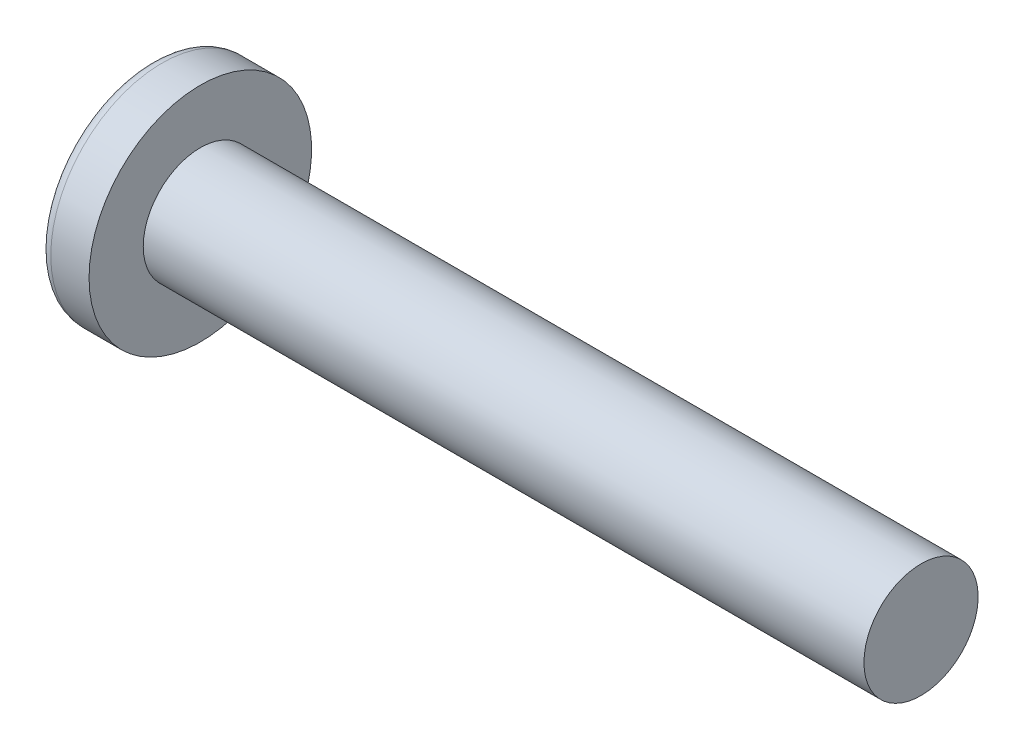
ISO-10303-21;
HEADER;
FILE_DESCRIPTION(('STEP AP214'),'2;1');
FILE_NAME('part.step','',(''),(''),'','','');
FILE_SCHEMA(('AUTOMOTIVE_DESIGN { 1 0 10303 214 1 1 1 1 }'));
ENDSEC;
DATA;
#1=APPLICATION_CONTEXT('core data for automotive mechanical design processes');
#2=APPLICATION_PROTOCOL_DEFINITION('international standard','automotive_design',2000,#1);
#3=PRODUCT_CONTEXT('',#1,'mechanical');
#4=PRODUCT('Part','Part','',(#3));
#5=PRODUCT_RELATED_PRODUCT_CATEGORY('part','',(#4));
#6=PRODUCT_DEFINITION_FORMATION('','',#4);
#7=PRODUCT_DEFINITION_CONTEXT('part definition',#1,'design');
#8=PRODUCT_DEFINITION('design','',#6,#7);
#9=PRODUCT_DEFINITION_SHAPE('','',#8);
#10=(LENGTH_UNIT() NAMED_UNIT(*) SI_UNIT(.MILLI.,.METRE.));
#11=(NAMED_UNIT(*) PLANE_ANGLE_UNIT() SI_UNIT($,.RADIAN.));
#12=(NAMED_UNIT(*) SI_UNIT($,.STERADIAN.) SOLID_ANGLE_UNIT());
#13=UNCERTAINTY_MEASURE_WITH_UNIT(LENGTH_MEASURE(1.E-05),#10,'distance_accuracy_value','');
#14=(GEOMETRIC_REPRESENTATION_CONTEXT(3) GLOBAL_UNCERTAINTY_ASSIGNED_CONTEXT((#13)) GLOBAL_UNIT_ASSIGNED_CONTEXT((#10,
#11,#12)) REPRESENTATION_CONTEXT('',''));
#15=CARTESIAN_POINT('',(0.,0.,0.));
#16=DIRECTION('',(0.,0.,1.));
#17=DIRECTION('',(1.,0.,0.));
#18=AXIS2_PLACEMENT_3D('',#15,#16,#17);
#19=CARTESIAN_POINT('',(4.02336,0.,0.));
#20=DIRECTION('',(-1.,0.,0.));
#21=DIRECTION('',(0.,1.,0.));
#22=AXIS2_PLACEMENT_3D('',#19,#20,#21);
#23=SPHERICAL_SURFACE('',#22,4.02336);
#24=CARTESIAN_POINT('',(0.754157473864418,0.,0.));
#25=DIRECTION('',(-1.,0.,0.));
#26=DIRECTION('',(0.,0.,1.));
#27=AXIS2_PLACEMENT_3D('',#24,#25,#26);
#28=CIRCLE('',#27,2.3451525606469);
#29=CARTESIAN_POINT('',(0.754157473864418,0.,2.3451525606469));
#30=VERTEX_POINT('',#29);
#31=EDGE_CURVE('E155',#30,#30,#28,.T.);
#32=ORIENTED_EDGE('',*,*,#31,.T.);
#33=EDGE_LOOP('',(#32));
#34=FACE_BOUND('',#33,.T.);
#35=CARTESIAN_POINT('',(4.01770186530247,-0.0538498336730852,0.));
#36=DIRECTION('',(-0.104497210902911,-0.994525179627702,0.));
#37=DIRECTION('',(0.994525179627702,-0.104497210902911,0.));
#38=AXIS2_PLACEMENT_3D('',#35,#36,#37);
#39=CIRCLE('',#38,4.02299563391823);
#40=CARTESIAN_POINT('',(0.259410845244607,0.341043063361975,1.37978334493095));
#41=VERTEX_POINT('',#40);
#42=CARTESIAN_POINT('',(0.0332155077767118,0.364809964762591,0.364809964762592));
#43=VERTEX_POINT('',#42);
#44=EDGE_CURVE('E186',#41,#43,#39,.T.);
#45=ORIENTED_EDGE('',*,*,#44,.F.);
#46=CARTESIAN_POINT('',(3.2260782242415,0.,-0.995700317236856));
#47=DIRECTION('',(0.625039893301157,0.,0.780592807923618));
#48=DIRECTION('',(0.780592807923618,0.,-0.625039893301158));
#49=AXIS2_PLACEMENT_3D('',#46,#47,#48);
#50=CIRCLE('',#49,3.81580245006182);
#51=CARTESIAN_POINT('',(0.259410845244606,-0.341043063361985,1.37978334493095));
#52=VERTEX_POINT('',#51);
#53=EDGE_CURVE('E151',#41,#52,#50,.T.);
#54=ORIENTED_EDGE('',*,*,#53,.T.);
#55=CARTESIAN_POINT('',(4.01770186530246,0.0538498336730848,0.));
#56=DIRECTION('',(-0.104497210902911,0.994525179627702,0.));
#57=DIRECTION('',(-0.994525179627702,-0.104497210902911,0.));
#58=AXIS2_PLACEMENT_3D('',#55,#56,#57);
#59=CIRCLE('',#58,4.02299563391823);
#60=CARTESIAN_POINT('',(0.0332155077767127,-0.364809964762593,0.364809964762591));
#61=VERTEX_POINT('',#60);
#62=EDGE_CURVE('E107',#61,#52,#59,.T.);
#63=ORIENTED_EDGE('',*,*,#62,.F.);
#64=CARTESIAN_POINT('',(4.01770186530247,0.,-0.0538498336730848));
#65=DIRECTION('',(-0.104497210902911,0.,-0.994525179627702));
#66=DIRECTION('',(-0.994525179627702,0.,0.104497210902911));
#67=AXIS2_PLACEMENT_3D('',#64,#65,#66);
#68=CIRCLE('',#67,4.02299563391823);
#69=CARTESIAN_POINT('',(0.259410845244606,-1.37978334493095,0.341043063361979));
#70=VERTEX_POINT('',#69);
#71=EDGE_CURVE('E132',#70,#61,#68,.T.);
#72=ORIENTED_EDGE('',*,*,#71,.F.);
#73=CARTESIAN_POINT('',(3.2260782242415,0.995700317236855,0.));
#74=DIRECTION('',(0.625039893301157,-0.780592807923618,0.));
#75=DIRECTION('',(0.780592807923618,0.625039893301158,0.));
#76=AXIS2_PLACEMENT_3D('',#73,#74,#75);
#77=CIRCLE('',#76,3.81580245006182);
#78=CARTESIAN_POINT('',(0.259410845244606,-1.37978334493095,-0.34104306336198));
#79=VERTEX_POINT('',#78);
#80=EDGE_CURVE('E140',#70,#79,#77,.T.);
#81=ORIENTED_EDGE('',*,*,#80,.T.);
#82=CARTESIAN_POINT('',(4.01770186530247,0.,0.0538498336730852));
#83=DIRECTION('',(-0.104497210902911,0.,0.994525179627702));
#84=DIRECTION('',(0.994525179627702,0.,0.104497210902911));
#85=AXIS2_PLACEMENT_3D('',#82,#83,#84);
#86=CIRCLE('',#85,4.02299563391823);
#87=CARTESIAN_POINT('',(0.0332155077767127,-0.36480996476259,-0.364809964762592));
#88=VERTEX_POINT('',#87);
#89=EDGE_CURVE('E50',#88,#79,#86,.T.);
#90=ORIENTED_EDGE('',*,*,#89,.F.);
#91=CARTESIAN_POINT('',(0.259410845244607,-0.341043063361974,-1.37978334493095));
#92=VERTEX_POINT('',#91);
#93=EDGE_CURVE('E193',#92,#88,#59,.T.);
#94=ORIENTED_EDGE('',*,*,#93,.F.);
#95=CARTESIAN_POINT('',(3.2260782242415,0.,0.995700317236856));
#96=DIRECTION('',(0.625039893301157,0.,-0.780592807923618));
#97=DIRECTION('',(-0.780592807923618,0.,-0.625039893301158));
#98=AXIS2_PLACEMENT_3D('',#95,#96,#97);
#99=CIRCLE('',#98,3.81580245006182);
#100=CARTESIAN_POINT('',(0.259410845244607,0.341043063361985,-1.37978334493095));
#101=VERTEX_POINT('',#100);
#102=EDGE_CURVE('E133',#92,#101,#99,.T.);
#103=ORIENTED_EDGE('',*,*,#102,.T.);
#104=CARTESIAN_POINT('',(0.0332155077767118,0.364809964762593,-0.364809964762592));
#105=VERTEX_POINT('',#104);
#106=EDGE_CURVE('E181',#105,#101,#39,.T.);
#107=ORIENTED_EDGE('',*,*,#106,.F.);
#108=CARTESIAN_POINT('',(0.259410845244607,1.37978334493095,-0.34104306336198));
#109=VERTEX_POINT('',#108);
#110=EDGE_CURVE('E43',#109,#105,#86,.T.);
#111=ORIENTED_EDGE('',*,*,#110,.F.);
#112=CARTESIAN_POINT('',(3.2260782242415,-0.995700317236856,0.));
#113=DIRECTION('',(0.625039893301157,0.780592807923618,0.));
#114=DIRECTION('',(-0.780592807923618,0.625039893301158,0.));
#115=AXIS2_PLACEMENT_3D('',#112,#113,#114);
#116=CIRCLE('',#115,3.81580245006182);
#117=CARTESIAN_POINT('',(0.259410845244607,1.37978334493095,0.34104306336198));
#118=VERTEX_POINT('',#117);
#119=EDGE_CURVE('E11',#109,#118,#116,.T.);
#120=ORIENTED_EDGE('',*,*,#119,.T.);
#121=EDGE_CURVE('E169',#43,#118,#68,.T.);
#122=ORIENTED_EDGE('',*,*,#121,.F.);
#123=EDGE_LOOP('',(#45,#54,#63,#72,#81,#90,#94,#103,#107,#111,#120,#122));
#124=FACE_BOUND('',#123,.T.);
#125=ADVANCED_FACE('F35',(#34,#124),#23,.T.);
#126=CARTESIAN_POINT('',(1.98257918552036,0.,-0.159985520361991));
#127=DIRECTION('',(-0.104497210902911,0.,0.994525179627702));
#128=DIRECTION('',(0.994525179627702,0.,0.104497210902911));
#129=AXIS2_PLACEMENT_3D('',#126,#127,#128);
#130=PLANE('',#129);
#131=ORIENTED_EDGE('',*,*,#110,.T.);
#132=DIRECTION('',(0.989139306726397,-0.103931303967629,0.103931303967629));
#133=VECTOR('',#132,1.);
#134=CARTESIAN_POINT('',(1.99902610304942,0.158257402215822,-0.158257402215822));
#135=LINE('',#134,#133);
#136=CARTESIAN_POINT('',(1.7526,0.184150000000001,-0.184149999999999));
#137=VERTEX_POINT('',#136);
#138=EDGE_CURVE('E175',#105,#137,#135,.T.);
#139=ORIENTED_EDGE('',*,*,#138,.T.);
#140=DIRECTION('',(0.777980423727664,-0.622948092912368,0.0817443198844284));
#141=VECTOR('',#140,1.);
#142=CARTESIAN_POINT('',(0.,1.5875,-0.3683));
#143=LINE('',#142,#141);
#144=EDGE_CURVE('E156',#109,#137,#143,.T.);
#145=ORIENTED_EDGE('',*,*,#144,.F.);
#146=EDGE_LOOP('',(#131,#139,#145));
#147=FACE_BOUND('',#146,.T.);
#148=ADVANCED_FACE('F174',(#147),#130,.T.);
#149=DIRECTION('',(0.777980423727664,0.622948092912368,0.0817443198844285));
#150=VECTOR('',#149,1.);
#151=CARTESIAN_POINT('',(0.,-1.5875,-0.3683));
#152=LINE('',#151,#150);
#153=CARTESIAN_POINT('',(1.7526,-0.18415,-0.18415));
#154=VERTEX_POINT('',#153);
#155=EDGE_CURVE('E141',#79,#154,#152,.T.);
#156=ORIENTED_EDGE('',*,*,#155,.T.);
#157=DIRECTION('',(-0.989139306726397,-0.103931303967628,-0.103931303967629));
#158=VECTOR('',#157,1.);
#159=CARTESIAN_POINT('',(1.99902610304942,-0.158257402215821,-0.158257402215822));
#160=LINE('',#159,#158);
#161=EDGE_CURVE('E196',#154,#88,#160,.T.);
#162=ORIENTED_EDGE('',*,*,#161,.T.);
#163=ORIENTED_EDGE('',*,*,#89,.T.);
#164=EDGE_LOOP('',(#156,#162,#163));
#165=FACE_BOUND('',#164,.T.);
#166=ADVANCED_FACE('F211',(#165),#130,.T.);
#167=CARTESIAN_POINT('',(1.98257918552036,0.,0.159985520361991));
#168=DIRECTION('',(-0.104497210902911,0.,-0.994525179627702));
#169=DIRECTION('',(-0.994525179627702,0.,0.104497210902911));
#170=AXIS2_PLACEMENT_3D('',#167,#168,#169);
#171=PLANE('',#170);
#172=DIRECTION('',(0.777980423727664,-0.622948092912368,-0.0817443198844284));
#173=VECTOR('',#172,1.);
#174=CARTESIAN_POINT('',(0.,1.5875,0.3683));
#175=LINE('',#174,#173);
#176=CARTESIAN_POINT('',(1.7526,0.18415,0.18415));
#177=VERTEX_POINT('',#176);
#178=EDGE_CURVE('E212',#118,#177,#175,.T.);
#179=ORIENTED_EDGE('',*,*,#178,.T.);
#180=DIRECTION('',(-0.989139306726397,0.103931303967628,0.103931303967628));
#181=VECTOR('',#180,1.);
#182=CARTESIAN_POINT('',(1.99902610304942,0.158257402215821,0.158257402215822));
#183=LINE('',#182,#181);
#184=EDGE_CURVE('E190',#177,#43,#183,.T.);
#185=ORIENTED_EDGE('',*,*,#184,.T.);
#186=ORIENTED_EDGE('',*,*,#121,.T.);
#187=EDGE_LOOP('',(#179,#185,#186));
#188=FACE_BOUND('',#187,.T.);
#189=ADVANCED_FACE('F216',(#188),#171,.T.);
#190=ORIENTED_EDGE('',*,*,#71,.T.);
#191=DIRECTION('',(0.989139306726397,0.103931303967629,-0.103931303967628));
#192=VECTOR('',#191,1.);
#193=CARTESIAN_POINT('',(1.99902610304942,-0.158257402215822,0.158257402215822));
#194=LINE('',#193,#192);
#195=CARTESIAN_POINT('',(1.7526,-0.184150000000001,0.18415));
#196=VERTEX_POINT('',#195);
#197=EDGE_CURVE('E105',#61,#196,#194,.T.);
#198=ORIENTED_EDGE('',*,*,#197,.T.);
#199=DIRECTION('',(0.777980423727664,0.622948092912368,-0.0817443198844282));
#200=VECTOR('',#199,1.);
#201=CARTESIAN_POINT('',(0.,-1.5875,0.368299999999999));
#202=LINE('',#201,#200);
#203=EDGE_CURVE('E130',#70,#196,#202,.T.);
#204=ORIENTED_EDGE('',*,*,#203,.F.);
#205=EDGE_LOOP('',(#190,#198,#204));
#206=FACE_BOUND('',#205,.T.);
#207=ADVANCED_FACE('F129',(#206),#171,.T.);
#208=CARTESIAN_POINT('',(-25.4,0.,0.));
#209=DIRECTION('',(-1.,0.,0.));
#210=DIRECTION('',(0.,0.,1.));
#211=AXIS2_PLACEMENT_3D('',#208,#209,#210);
#212=CYLINDRICAL_SURFACE('',#211,1.2573);
#213=CARTESIAN_POINT('',(17.6784,0.,0.));
#214=DIRECTION('',(-1.,0.,0.));
#215=DIRECTION('',(0.,0.,1.));
#216=AXIS2_PLACEMENT_3D('',#213,#214,#215);
#217=CIRCLE('',#216,1.2573);
#218=CARTESIAN_POINT('',(17.6784,0.,1.2573));
#219=VERTEX_POINT('',#218);
#220=EDGE_CURVE('E152',#219,#219,#217,.T.);
#221=ORIENTED_EDGE('',*,*,#220,.T.);
#222=EDGE_LOOP('',(#221));
#223=FACE_BOUND('',#222,.T.);
#224=CARTESIAN_POINT('',(1.8034,0.,0.));
#225=DIRECTION('',(-1.,0.,0.));
#226=DIRECTION('',(0.,0.,1.));
#227=AXIS2_PLACEMENT_3D('',#224,#225,#226);
#228=CIRCLE('',#227,1.2573);
#229=CARTESIAN_POINT('',(1.8034,0.,1.2573));
#230=VERTEX_POINT('',#229);
#231=EDGE_CURVE('E165',#230,#230,#228,.T.);
#232=ORIENTED_EDGE('',*,*,#231,.F.);
#233=EDGE_LOOP('',(#232));
#234=FACE_BOUND('',#233,.T.);
#235=ADVANCED_FACE('F37',(#223,#234),#212,.T.);
#236=CARTESIAN_POINT('',(1.8034,1.2573,0.));
#237=DIRECTION('',(-1.,0.,0.));
#238=DIRECTION('',(0.,0.,1.));
#239=AXIS2_PLACEMENT_3D('',#236,#237,#238);
#240=PLANE('',#239);
#241=CARTESIAN_POINT('',(1.8034,0.,0.));
#242=DIRECTION('',(-1.,0.,0.));
#243=DIRECTION('',(0.,0.,1.));
#244=AXIS2_PLACEMENT_3D('',#241,#242,#243);
#245=CIRCLE('',#244,2.4511);
#246=CARTESIAN_POINT('',(1.8034,0.,2.4511));
#247=VERTEX_POINT('',#246);
#248=EDGE_CURVE('E162',#247,#247,#245,.T.);
#249=ORIENTED_EDGE('',*,*,#248,.F.);
#250=EDGE_LOOP('',(#249));
#251=FACE_BOUND('',#250,.T.);
#252=ORIENTED_EDGE('',*,*,#231,.T.);
#253=EDGE_LOOP('',(#252));
#254=FACE_BOUND('',#253,.T.);
#255=ADVANCED_FACE('F244',(#251,#254),#240,.F.);
#256=CARTESIAN_POINT('',(-25.4,0.,0.));
#257=DIRECTION('',(-1.,0.,0.));
#258=DIRECTION('',(0.,0.,1.));
#259=AXIS2_PLACEMENT_3D('',#256,#257,#258);
#260=CYLINDRICAL_SURFACE('',#259,2.4511);
#261=ORIENTED_EDGE('',*,*,#248,.T.);
#262=EDGE_LOOP('',(#261));
#263=FACE_BOUND('',#262,.T.);
#264=CARTESIAN_POINT('',(0.960546522231563,0.,0.));
#265=DIRECTION('',(-1.,0.,0.));
#266=DIRECTION('',(0.,0.,1.));
#267=AXIS2_PLACEMENT_3D('',#264,#265,#266);
#268=CIRCLE('',#267,2.4511);
#269=CARTESIAN_POINT('',(0.960546522231563,0.,2.4511));
#270=VERTEX_POINT('',#269);
#271=EDGE_CURVE('E159',#270,#270,#268,.T.);
#272=ORIENTED_EDGE('',*,*,#271,.F.);
#273=EDGE_LOOP('',(#272));
#274=FACE_BOUND('',#273,.T.);
#275=ADVANCED_FACE('F241',(#263,#274),#260,.T.);
#276=CARTESIAN_POINT('',(0.960546522231562,0.,0.));
#277=DIRECTION('',(-1.,0.,0.));
#278=DIRECTION('',(0.,0.,1.));
#279=AXIS2_PLACEMENT_3D('',#276,#277,#278);
#280=TOROIDAL_SURFACE('',#279,2.1971,0.254);
#281=ORIENTED_EDGE('',*,*,#271,.T.);
#282=EDGE_LOOP('',(#281));
#283=FACE_BOUND('',#282,.T.);
#284=ORIENTED_EDGE('',*,*,#31,.F.);
#285=EDGE_LOOP('',(#284));
#286=FACE_BOUND('',#285,.T.);
#287=ADVANCED_FACE('F238',(#283,#286),#280,.T.);
#288=CARTESIAN_POINT('',(17.6784,1.2573,0.));
#289=DIRECTION('',(1.,0.,0.));
#290=DIRECTION('',(0.,0.,-1.));
#291=AXIS2_PLACEMENT_3D('',#288,#289,#290);
#292=PLANE('',#291);
#293=ORIENTED_EDGE('',*,*,#220,.F.);
#294=EDGE_LOOP('',(#293));
#295=FACE_BOUND('',#294,.T.);
#296=ADVANCED_FACE('F236',(#295),#292,.T.);
#297=CARTESIAN_POINT('',(1.7526,0.18415,0.18415));
#298=DIRECTION('',(0.625039893301157,0.780592807923618,0.));
#299=DIRECTION('',(-0.780592807923618,0.625039893301158,0.));
#300=AXIS2_PLACEMENT_3D('',#297,#298,#299);
#301=PLANE('',#300);
#302=ORIENTED_EDGE('',*,*,#144,.T.);
#303=DIRECTION('',(0.,0.,-1.));
#304=VECTOR('',#303,1.);
#305=CARTESIAN_POINT('',(1.7526,0.18415,0.18415));
#306=LINE('',#305,#304);
#307=EDGE_CURVE('E123',#177,#137,#306,.T.);
#308=ORIENTED_EDGE('',*,*,#307,.F.);
#309=ORIENTED_EDGE('',*,*,#178,.F.);
#310=ORIENTED_EDGE('',*,*,#119,.F.);
#311=EDGE_LOOP('',(#302,#308,#309,#310));
#312=FACE_BOUND('',#311,.T.);
#313=ADVANCED_FACE('F215',(#312),#301,.F.);
#314=CARTESIAN_POINT('',(1.7526,-0.18415,-0.18415));
#315=DIRECTION('',(0.625039893301157,-0.780592807923618,0.));
#316=DIRECTION('',(0.780592807923618,0.625039893301158,0.));
#317=AXIS2_PLACEMENT_3D('',#314,#315,#316);
#318=PLANE('',#317);
#319=ORIENTED_EDGE('',*,*,#203,.T.);
#320=DIRECTION('',(0.,0.,1.));
#321=VECTOR('',#320,1.);
#322=CARTESIAN_POINT('',(1.7526,-0.18415,-0.18415));
#323=LINE('',#322,#321);
#324=EDGE_CURVE('E122',#154,#196,#323,.T.);
#325=ORIENTED_EDGE('',*,*,#324,.F.);
#326=ORIENTED_EDGE('',*,*,#155,.F.);
#327=ORIENTED_EDGE('',*,*,#80,.F.);
#328=EDGE_LOOP('',(#319,#325,#326,#327));
#329=FACE_BOUND('',#328,.T.);
#330=ADVANCED_FACE('F137',(#329),#318,.F.);
#331=CARTESIAN_POINT('',(1.7526,0.18415,-0.18415));
#332=DIRECTION('',(-1.,0.,0.));
#333=DIRECTION('',(0.,0.,1.));
#334=AXIS2_PLACEMENT_3D('',#331,#332,#333);
#335=PLANE('',#334);
#336=DIRECTION('',(0.,1.,0.));
#337=VECTOR('',#336,1.);
#338=CARTESIAN_POINT('',(1.7526,-0.18415,-0.18415));
#339=LINE('',#338,#337);
#340=EDGE_CURVE('E145',#154,#137,#339,.T.);
#341=ORIENTED_EDGE('',*,*,#340,.F.);
#342=ORIENTED_EDGE('',*,*,#324,.T.);
#343=DIRECTION('',(0.,-1.,0.));
#344=VECTOR('',#343,1.);
#345=CARTESIAN_POINT('',(1.7526,0.18415,0.18415));
#346=LINE('',#345,#344);
#347=EDGE_CURVE('E114',#177,#196,#346,.T.);
#348=ORIENTED_EDGE('',*,*,#347,.F.);
#349=ORIENTED_EDGE('',*,*,#307,.T.);
#350=EDGE_LOOP('',(#341,#342,#348,#349));
#351=FACE_BOUND('',#350,.T.);
#352=ADVANCED_FACE('F143',(#351),#335,.T.);
#353=CARTESIAN_POINT('',(1.7526,0.184150000000001,-0.184149999999999));
#354=DIRECTION('',(0.625039893301157,0.,-0.780592807923618));
#355=DIRECTION('',(0.780592807923618,0.,0.625039893301158));
#356=AXIS2_PLACEMENT_3D('',#353,#354,#355);
#357=PLANE('',#356);
#358=DIRECTION('',(0.777980423727664,0.0817443198844261,0.622948092912369));
#359=VECTOR('',#358,1.);
#360=CARTESIAN_POINT('',(0.,-0.368299999999994,-1.5875));
#361=LINE('',#360,#359);
#362=EDGE_CURVE('E201',#92,#154,#361,.T.);
#363=ORIENTED_EDGE('',*,*,#362,.T.);
#364=ORIENTED_EDGE('',*,*,#340,.T.);
#365=DIRECTION('',(0.777980423727664,-0.0817443198844306,0.622948092912368));
#366=VECTOR('',#365,1.);
#367=CARTESIAN_POINT('',(0.,0.368300000000006,-1.5875));
#368=LINE('',#367,#366);
#369=EDGE_CURVE('E111',#101,#137,#368,.T.);
#370=ORIENTED_EDGE('',*,*,#369,.F.);
#371=ORIENTED_EDGE('',*,*,#102,.F.);
#372=EDGE_LOOP('',(#363,#364,#370,#371));
#373=FACE_BOUND('',#372,.T.);
#374=ADVANCED_FACE('F206',(#373),#357,.F.);
#375=CARTESIAN_POINT('',(1.98257918552036,-0.159985520361991,0.));
#376=DIRECTION('',(-0.104497210902911,0.994525179627702,0.));
#377=DIRECTION('',(-0.994525179627702,-0.104497210902911,0.));
#378=AXIS2_PLACEMENT_3D('',#375,#376,#377);
#379=PLANE('',#378);
#380=ORIENTED_EDGE('',*,*,#93,.T.);
#381=ORIENTED_EDGE('',*,*,#161,.F.);
#382=ORIENTED_EDGE('',*,*,#362,.F.);
#383=EDGE_LOOP('',(#380,#381,#382));
#384=FACE_BOUND('',#383,.T.);
#385=ADVANCED_FACE('F210',(#384),#379,.T.);
#386=CARTESIAN_POINT('',(1.98257918552036,0.159985520361991,0.));
#387=DIRECTION('',(-0.104497210902911,-0.994525179627702,0.));
#388=DIRECTION('',(0.994525179627702,-0.104497210902911,0.));
#389=AXIS2_PLACEMENT_3D('',#386,#387,#388);
#390=PLANE('',#389);
#391=ORIENTED_EDGE('',*,*,#106,.T.);
#392=ORIENTED_EDGE('',*,*,#369,.T.);
#393=ORIENTED_EDGE('',*,*,#138,.F.);
#394=EDGE_LOOP('',(#391,#392,#393));
#395=FACE_BOUND('',#394,.T.);
#396=ADVANCED_FACE('F204',(#395),#390,.T.);
#397=CARTESIAN_POINT('',(1.7526,-0.184150000000001,0.184149999999999));
#398=DIRECTION('',(0.625039893301157,0.,0.780592807923618));
#399=DIRECTION('',(-0.780592807923618,0.,0.625039893301158));
#400=AXIS2_PLACEMENT_3D('',#397,#398,#399);
#401=PLANE('',#400);
#402=DIRECTION('',(0.777980423727664,-0.0817443198844263,-0.622948092912369));
#403=VECTOR('',#402,1.);
#404=CARTESIAN_POINT('',(0.,0.368299999999994,1.5875));
#405=LINE('',#404,#403);
#406=EDGE_CURVE('E110',#41,#177,#405,.T.);
#407=ORIENTED_EDGE('',*,*,#406,.T.);
#408=ORIENTED_EDGE('',*,*,#347,.T.);
#409=DIRECTION('',(0.777980423727664,0.0817443198844306,-0.622948092912368));
#410=VECTOR('',#409,1.);
#411=CARTESIAN_POINT('',(0.,-0.368300000000005,1.5875));
#412=LINE('',#411,#410);
#413=EDGE_CURVE('E101',#52,#196,#412,.T.);
#414=ORIENTED_EDGE('',*,*,#413,.F.);
#415=ORIENTED_EDGE('',*,*,#53,.F.);
#416=EDGE_LOOP('',(#407,#408,#414,#415));
#417=FACE_BOUND('',#416,.T.);
#418=ADVANCED_FACE('F115',(#417),#401,.F.);
#419=ORIENTED_EDGE('',*,*,#44,.T.);
#420=ORIENTED_EDGE('',*,*,#184,.F.);
#421=ORIENTED_EDGE('',*,*,#406,.F.);
#422=EDGE_LOOP('',(#419,#420,#421));
#423=FACE_BOUND('',#422,.T.);
#424=ADVANCED_FACE('F217',(#423),#390,.T.);
#425=ORIENTED_EDGE('',*,*,#62,.T.);
#426=ORIENTED_EDGE('',*,*,#413,.T.);
#427=ORIENTED_EDGE('',*,*,#197,.F.);
#428=EDGE_LOOP('',(#425,#426,#427));
#429=FACE_BOUND('',#428,.T.);
#430=ADVANCED_FACE('F103',(#429),#379,.T.);
#431=CLOSED_SHELL('',(#125,#148,#166,#189,#207,#235,#255,#275,#287,#296,#313,#330,#352,#374,
#385,#396,#418,#424,#430));
#432=MANIFOLD_SOLID_BREP('B2',#431);
#433=ADVANCED_BREP_SHAPE_REPRESENTATION('',(#18,#432),#14);
#434=SHAPE_DEFINITION_REPRESENTATION(#9,#433);
ENDSEC;
END-ISO-10303-21;
